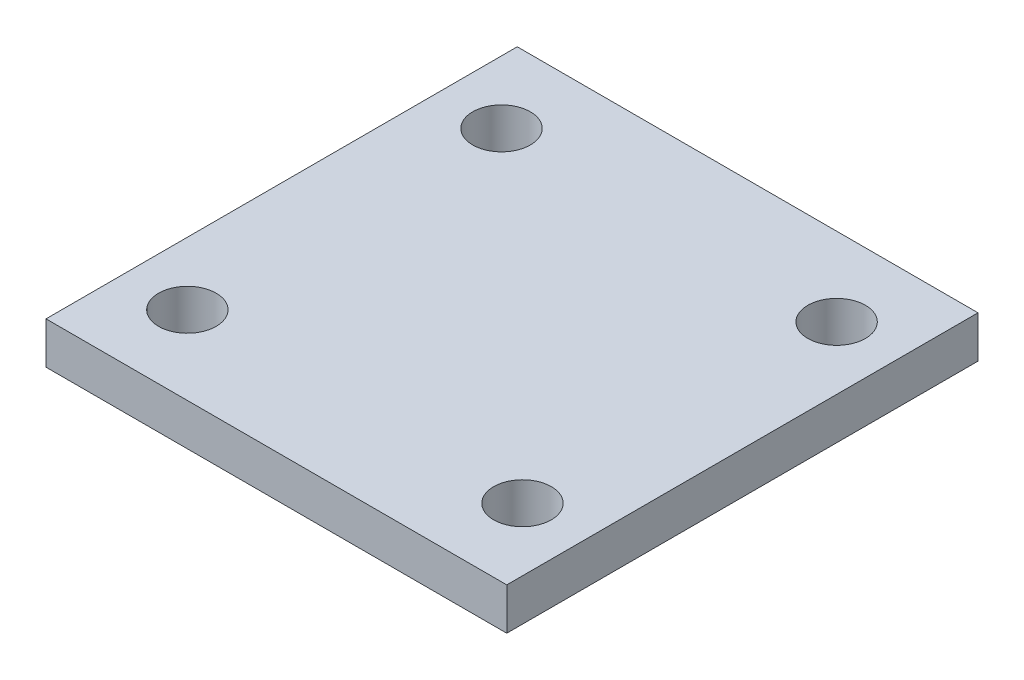
ISO-10303-21;
HEADER;
FILE_DESCRIPTION(('STEP AP214'),'2;1');
FILE_NAME('part.step','',(''),(''),'','','');
FILE_SCHEMA(('AUTOMOTIVE_DESIGN { 1 0 10303 214 1 1 1 1 }'));
ENDSEC;
DATA;
#1=APPLICATION_CONTEXT('core data for automotive mechanical design processes');
#2=APPLICATION_PROTOCOL_DEFINITION('international standard','automotive_design',2000,#1);
#3=PRODUCT_CONTEXT('',#1,'mechanical');
#4=PRODUCT('Part','Part','',(#3));
#5=PRODUCT_RELATED_PRODUCT_CATEGORY('part','',(#4));
#6=PRODUCT_DEFINITION_FORMATION('','',#4);
#7=PRODUCT_DEFINITION_CONTEXT('part definition',#1,'design');
#8=PRODUCT_DEFINITION('design','',#6,#7);
#9=PRODUCT_DEFINITION_SHAPE('','',#8);
#10=(LENGTH_UNIT() NAMED_UNIT(*) SI_UNIT(.MILLI.,.METRE.));
#11=(NAMED_UNIT(*) PLANE_ANGLE_UNIT() SI_UNIT($,.RADIAN.));
#12=(NAMED_UNIT(*) SI_UNIT($,.STERADIAN.) SOLID_ANGLE_UNIT());
#13=UNCERTAINTY_MEASURE_WITH_UNIT(LENGTH_MEASURE(1.E-05),#10,'distance_accuracy_value','');
#14=(GEOMETRIC_REPRESENTATION_CONTEXT(3) GLOBAL_UNCERTAINTY_ASSIGNED_CONTEXT((#13)) GLOBAL_UNIT_ASSIGNED_CONTEXT((#10,
#11,#12)) REPRESENTATION_CONTEXT('',''));
#15=CARTESIAN_POINT('',(0.,0.,0.));
#16=DIRECTION('',(0.,0.,1.));
#17=DIRECTION('',(1.,0.,0.));
#18=AXIS2_PLACEMENT_3D('',#15,#16,#17);
#19=CARTESIAN_POINT('',(-22.,4.,22.5));
#20=DIRECTION('',(1.,0.,0.));
#21=DIRECTION('',(0.,0.,-1.));
#22=AXIS2_PLACEMENT_3D('',#19,#20,#21);
#23=PLANE('',#22);
#24=DIRECTION('',(0.,0.,1.));
#25=VECTOR('',#24,1.);
#26=CARTESIAN_POINT('',(-22.,0.,22.5));
#27=LINE('',#26,#25);
#28=CARTESIAN_POINT('',(-22.,0.,-22.5));
#29=VERTEX_POINT('',#28);
#30=CARTESIAN_POINT('',(-22.,0.,22.5));
#31=VERTEX_POINT('',#30);
#32=EDGE_CURVE('E112',#29,#31,#27,.T.);
#33=ORIENTED_EDGE('',*,*,#32,.T.);
#34=DIRECTION('',(0.,-1.,0.));
#35=VECTOR('',#34,1.);
#36=CARTESIAN_POINT('',(-22.,4.,22.5));
#37=LINE('',#36,#35);
#38=CARTESIAN_POINT('',(-22.,4.,22.5));
#39=VERTEX_POINT('',#38);
#40=EDGE_CURVE('E11',#39,#31,#37,.T.);
#41=ORIENTED_EDGE('',*,*,#40,.F.);
#42=DIRECTION('',(0.,0.,1.));
#43=VECTOR('',#42,1.);
#44=CARTESIAN_POINT('',(-22.,4.,22.5));
#45=LINE('',#44,#43);
#46=CARTESIAN_POINT('',(-22.,4.,-22.5));
#47=VERTEX_POINT('',#46);
#48=EDGE_CURVE('E96',#47,#39,#45,.T.);
#49=ORIENTED_EDGE('',*,*,#48,.F.);
#50=DIRECTION('',(0.,-1.,0.));
#51=VECTOR('',#50,1.);
#52=CARTESIAN_POINT('',(-22.,4.,-22.5));
#53=LINE('',#52,#51);
#54=EDGE_CURVE('E108',#47,#29,#53,.T.);
#55=ORIENTED_EDGE('',*,*,#54,.T.);
#56=EDGE_LOOP('',(#33,#41,#49,#55));
#57=FACE_BOUND('',#56,.T.);
#58=ADVANCED_FACE('F41',(#57),#23,.F.);
#59=CARTESIAN_POINT('',(22.,4.,22.5));
#60=DIRECTION('',(0.,0.,-1.));
#61=DIRECTION('',(-1.,0.,0.));
#62=AXIS2_PLACEMENT_3D('',#59,#60,#61);
#63=PLANE('',#62);
#64=DIRECTION('',(1.,0.,0.));
#65=VECTOR('',#64,1.);
#66=CARTESIAN_POINT('',(22.,0.,22.5));
#67=LINE('',#66,#65);
#68=CARTESIAN_POINT('',(22.,0.,22.5));
#69=VERTEX_POINT('',#68);
#70=EDGE_CURVE('E101',#31,#69,#67,.T.);
#71=ORIENTED_EDGE('',*,*,#70,.T.);
#72=DIRECTION('',(0.,-1.,0.));
#73=VECTOR('',#72,1.);
#74=CARTESIAN_POINT('',(22.,4.,22.5));
#75=LINE('',#74,#73);
#76=CARTESIAN_POINT('',(22.,4.,22.5));
#77=VERTEX_POINT('',#76);
#78=EDGE_CURVE('E49',#77,#69,#75,.T.);
#79=ORIENTED_EDGE('',*,*,#78,.F.);
#80=DIRECTION('',(1.,0.,0.));
#81=VECTOR('',#80,1.);
#82=CARTESIAN_POINT('',(22.,4.,22.5));
#83=LINE('',#82,#81);
#84=EDGE_CURVE('E91',#39,#77,#83,.T.);
#85=ORIENTED_EDGE('',*,*,#84,.F.);
#86=ORIENTED_EDGE('',*,*,#40,.T.);
#87=EDGE_LOOP('',(#71,#79,#85,#86));
#88=FACE_BOUND('',#87,.T.);
#89=ADVANCED_FACE('F100',(#88),#63,.F.);
#90=CARTESIAN_POINT('',(22.,4.,22.5));
#91=DIRECTION('',(-1.,0.,0.));
#92=DIRECTION('',(0.,0.,1.));
#93=AXIS2_PLACEMENT_3D('',#90,#91,#92);
#94=PLANE('',#93);
#95=DIRECTION('',(0.,0.,-1.));
#96=VECTOR('',#95,1.);
#97=CARTESIAN_POINT('',(22.,0.,22.5));
#98=LINE('',#97,#96);
#99=CARTESIAN_POINT('',(22.,0.,-22.5));
#100=VERTEX_POINT('',#99);
#101=EDGE_CURVE('E78',#69,#100,#98,.T.);
#102=ORIENTED_EDGE('',*,*,#101,.T.);
#103=DIRECTION('',(0.,-1.,0.));
#104=VECTOR('',#103,1.);
#105=CARTESIAN_POINT('',(22.,4.,-22.5));
#106=LINE('',#105,#104);
#107=CARTESIAN_POINT('',(22.,4.,-22.5));
#108=VERTEX_POINT('',#107);
#109=EDGE_CURVE('E102',#108,#100,#106,.T.);
#110=ORIENTED_EDGE('',*,*,#109,.F.);
#111=DIRECTION('',(0.,0.,-1.));
#112=VECTOR('',#111,1.);
#113=CARTESIAN_POINT('',(22.,4.,22.5));
#114=LINE('',#113,#112);
#115=EDGE_CURVE('E94',#77,#108,#114,.T.);
#116=ORIENTED_EDGE('',*,*,#115,.F.);
#117=ORIENTED_EDGE('',*,*,#78,.T.);
#118=EDGE_LOOP('',(#102,#110,#116,#117));
#119=FACE_BOUND('',#118,.T.);
#120=ADVANCED_FACE('F103',(#119),#94,.F.);
#121=CARTESIAN_POINT('',(22.,4.,-22.5));
#122=DIRECTION('',(0.,0.,1.));
#123=DIRECTION('',(1.,0.,0.));
#124=AXIS2_PLACEMENT_3D('',#121,#122,#123);
#125=PLANE('',#124);
#126=DIRECTION('',(-1.,0.,0.));
#127=VECTOR('',#126,1.);
#128=CARTESIAN_POINT('',(22.,0.,-22.5));
#129=LINE('',#128,#127);
#130=EDGE_CURVE('E84',#100,#29,#129,.T.);
#131=ORIENTED_EDGE('',*,*,#130,.T.);
#132=ORIENTED_EDGE('',*,*,#54,.F.);
#133=DIRECTION('',(-1.,0.,0.));
#134=VECTOR('',#133,1.);
#135=CARTESIAN_POINT('',(22.,4.,-22.5));
#136=LINE('',#135,#134);
#137=EDGE_CURVE('E59',#108,#47,#136,.T.);
#138=ORIENTED_EDGE('',*,*,#137,.F.);
#139=ORIENTED_EDGE('',*,*,#109,.T.);
#140=EDGE_LOOP('',(#131,#132,#138,#139));
#141=FACE_BOUND('',#140,.T.);
#142=ADVANCED_FACE('F126',(#141),#125,.F.);
#143=CARTESIAN_POINT('',(0.,4.,0.));
#144=DIRECTION('',(0.,1.,0.));
#145=DIRECTION('',(0.,0.,1.));
#146=AXIS2_PLACEMENT_3D('',#143,#144,#145);
#147=PLANE('',#146);
#148=CARTESIAN_POINT('',(-16.,4.,15.));
#149=DIRECTION('',(0.,1.,0.));
#150=DIRECTION('',(0.,0.,1.));
#151=AXIS2_PLACEMENT_3D('',#148,#149,#150);
#152=CIRCLE('',#151,2.74999999999999);
#153=CARTESIAN_POINT('',(-16.,4.,17.75));
#154=VERTEX_POINT('',#153);
#155=EDGE_CURVE('E158',#154,#154,#152,.T.);
#156=ORIENTED_EDGE('',*,*,#155,.F.);
#157=EDGE_LOOP('',(#156));
#158=FACE_BOUND('',#157,.T.);
#159=CARTESIAN_POINT('',(-16.,4.,-15.));
#160=DIRECTION('',(0.,1.,0.));
#161=DIRECTION('',(0.,0.,1.));
#162=AXIS2_PLACEMENT_3D('',#159,#160,#161);
#163=CIRCLE('',#162,2.74999999999999);
#164=CARTESIAN_POINT('',(-16.,4.,-12.25));
#165=VERTEX_POINT('',#164);
#166=EDGE_CURVE('E151',#165,#165,#163,.T.);
#167=ORIENTED_EDGE('',*,*,#166,.F.);
#168=EDGE_LOOP('',(#167));
#169=FACE_BOUND('',#168,.T.);
#170=CARTESIAN_POINT('',(16.,4.,-15.));
#171=DIRECTION('',(0.,1.,0.));
#172=DIRECTION('',(0.,0.,1.));
#173=AXIS2_PLACEMENT_3D('',#170,#171,#172);
#174=CIRCLE('',#173,2.74999999999999);
#175=CARTESIAN_POINT('',(16.,4.,-12.25));
#176=VERTEX_POINT('',#175);
#177=EDGE_CURVE('E144',#176,#176,#174,.T.);
#178=ORIENTED_EDGE('',*,*,#177,.F.);
#179=EDGE_LOOP('',(#178));
#180=FACE_BOUND('',#179,.T.);
#181=CARTESIAN_POINT('',(16.,4.,15.));
#182=DIRECTION('',(0.,1.,0.));
#183=DIRECTION('',(0.,0.,1.));
#184=AXIS2_PLACEMENT_3D('',#181,#182,#183);
#185=CIRCLE('',#184,2.74999999999999);
#186=CARTESIAN_POINT('',(16.,4.,17.75));
#187=VERTEX_POINT('',#186);
#188=EDGE_CURVE('E137',#187,#187,#185,.T.);
#189=ORIENTED_EDGE('',*,*,#188,.F.);
#190=EDGE_LOOP('',(#189));
#191=FACE_BOUND('',#190,.T.);
#192=ORIENTED_EDGE('',*,*,#48,.T.);
#193=ORIENTED_EDGE('',*,*,#84,.T.);
#194=ORIENTED_EDGE('',*,*,#115,.T.);
#195=ORIENTED_EDGE('',*,*,#137,.T.);
#196=EDGE_LOOP('',(#192,#193,#194,#195));
#197=FACE_BOUND('',#196,.T.);
#198=ADVANCED_FACE('F92',(#158,#169,#180,#191,#197),#147,.T.);
#199=CARTESIAN_POINT('',(0.,0.,0.));
#200=DIRECTION('',(0.,1.,0.));
#201=DIRECTION('',(0.,0.,1.));
#202=AXIS2_PLACEMENT_3D('',#199,#200,#201);
#203=PLANE('',#202);
#204=CARTESIAN_POINT('',(-16.,0.,15.));
#205=DIRECTION('',(0.,1.,0.));
#206=DIRECTION('',(0.,0.,1.));
#207=AXIS2_PLACEMENT_3D('',#204,#205,#206);
#208=CIRCLE('',#207,2.75);
#209=CARTESIAN_POINT('',(-16.,0.,17.75));
#210=VERTEX_POINT('',#209);
#211=EDGE_CURVE('E154',#210,#210,#208,.T.);
#212=ORIENTED_EDGE('',*,*,#211,.T.);
#213=EDGE_LOOP('',(#212));
#214=FACE_BOUND('',#213,.T.);
#215=CARTESIAN_POINT('',(-16.,0.,-15.));
#216=DIRECTION('',(0.,1.,0.));
#217=DIRECTION('',(0.,0.,1.));
#218=AXIS2_PLACEMENT_3D('',#215,#216,#217);
#219=CIRCLE('',#218,2.75);
#220=CARTESIAN_POINT('',(-16.,0.,-12.25));
#221=VERTEX_POINT('',#220);
#222=EDGE_CURVE('E147',#221,#221,#219,.T.);
#223=ORIENTED_EDGE('',*,*,#222,.T.);
#224=EDGE_LOOP('',(#223));
#225=FACE_BOUND('',#224,.T.);
#226=CARTESIAN_POINT('',(16.,0.,-15.));
#227=DIRECTION('',(0.,1.,0.));
#228=DIRECTION('',(0.,0.,1.));
#229=AXIS2_PLACEMENT_3D('',#226,#227,#228);
#230=CIRCLE('',#229,2.75);
#231=CARTESIAN_POINT('',(16.,0.,-12.25));
#232=VERTEX_POINT('',#231);
#233=EDGE_CURVE('E140',#232,#232,#230,.T.);
#234=ORIENTED_EDGE('',*,*,#233,.T.);
#235=EDGE_LOOP('',(#234));
#236=FACE_BOUND('',#235,.T.);
#237=CARTESIAN_POINT('',(16.,0.,15.));
#238=DIRECTION('',(0.,1.,0.));
#239=DIRECTION('',(0.,0.,1.));
#240=AXIS2_PLACEMENT_3D('',#237,#238,#239);
#241=CIRCLE('',#240,2.75);
#242=CARTESIAN_POINT('',(16.,0.,17.75));
#243=VERTEX_POINT('',#242);
#244=EDGE_CURVE('E116',#243,#243,#241,.T.);
#245=ORIENTED_EDGE('',*,*,#244,.T.);
#246=EDGE_LOOP('',(#245));
#247=FACE_BOUND('',#246,.T.);
#248=ORIENTED_EDGE('',*,*,#32,.F.);
#249=ORIENTED_EDGE('',*,*,#130,.F.);
#250=ORIENTED_EDGE('',*,*,#101,.F.);
#251=ORIENTED_EDGE('',*,*,#70,.F.);
#252=EDGE_LOOP('',(#248,#249,#250,#251));
#253=FACE_BOUND('',#252,.T.);
#254=ADVANCED_FACE('F129',(#214,#225,#236,#247,#253),#203,.F.);
#255=CARTESIAN_POINT('',(16.,4.,15.));
#256=DIRECTION('',(0.,1.,0.));
#257=DIRECTION('',(0.,0.,1.));
#258=AXIS2_PLACEMENT_3D('',#255,#256,#257);
#259=CYLINDRICAL_SURFACE('',#258,2.74999999999999);
#260=ORIENTED_EDGE('',*,*,#244,.F.);
#261=EDGE_LOOP('',(#260));
#262=FACE_BOUND('',#261,.T.);
#263=ORIENTED_EDGE('',*,*,#188,.T.);
#264=EDGE_LOOP('',(#263));
#265=FACE_BOUND('',#264,.T.);
#266=ADVANCED_FACE('F173',(#262,#265),#259,.F.);
#267=CARTESIAN_POINT('',(16.,4.,-15.));
#268=DIRECTION('',(0.,1.,0.));
#269=DIRECTION('',(0.,0.,1.));
#270=AXIS2_PLACEMENT_3D('',#267,#268,#269);
#271=CYLINDRICAL_SURFACE('',#270,2.74999999999999);
#272=ORIENTED_EDGE('',*,*,#233,.F.);
#273=EDGE_LOOP('',(#272));
#274=FACE_BOUND('',#273,.T.);
#275=ORIENTED_EDGE('',*,*,#177,.T.);
#276=EDGE_LOOP('',(#275));
#277=FACE_BOUND('',#276,.T.);
#278=ADVANCED_FACE('F175',(#274,#277),#271,.F.);
#279=CARTESIAN_POINT('',(-16.,4.,-15.));
#280=DIRECTION('',(0.,1.,0.));
#281=DIRECTION('',(0.,0.,1.));
#282=AXIS2_PLACEMENT_3D('',#279,#280,#281);
#283=CYLINDRICAL_SURFACE('',#282,2.74999999999999);
#284=ORIENTED_EDGE('',*,*,#222,.F.);
#285=EDGE_LOOP('',(#284));
#286=FACE_BOUND('',#285,.T.);
#287=ORIENTED_EDGE('',*,*,#166,.T.);
#288=EDGE_LOOP('',(#287));
#289=FACE_BOUND('',#288,.T.);
#290=ADVANCED_FACE('F182',(#286,#289),#283,.F.);
#291=CARTESIAN_POINT('',(-16.,4.,15.));
#292=DIRECTION('',(0.,1.,0.));
#293=DIRECTION('',(0.,0.,1.));
#294=AXIS2_PLACEMENT_3D('',#291,#292,#293);
#295=CYLINDRICAL_SURFACE('',#294,2.74999999999999);
#296=ORIENTED_EDGE('',*,*,#211,.F.);
#297=EDGE_LOOP('',(#296));
#298=FACE_BOUND('',#297,.T.);
#299=ORIENTED_EDGE('',*,*,#155,.T.);
#300=EDGE_LOOP('',(#299));
#301=FACE_BOUND('',#300,.T.);
#302=ADVANCED_FACE('F162',(#298,#301),#295,.F.);
#303=CLOSED_SHELL('',(#58,#89,#120,#142,#198,#254,#266,#278,#290,#302));
#304=MANIFOLD_SOLID_BREP('B2',#303);
#305=ADVANCED_BREP_SHAPE_REPRESENTATION('',(#18,#304),#14);
#306=SHAPE_DEFINITION_REPRESENTATION(#9,#305);
ENDSEC;
END-ISO-10303-21;
